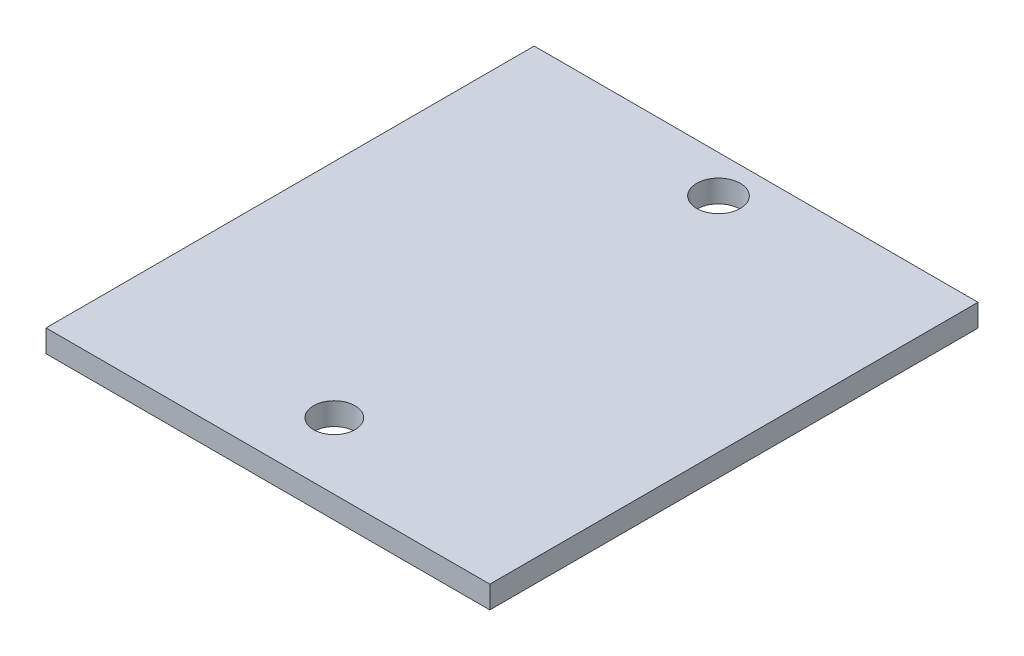
ISO-10303-21;
HEADER;
FILE_DESCRIPTION(('STEP AP214'),'2;1');
FILE_NAME('part.step','',(''),(''),'','','');
FILE_SCHEMA(('AUTOMOTIVE_DESIGN { 1 0 10303 214 1 1 1 1 }'));
ENDSEC;
DATA;
#1=APPLICATION_CONTEXT('core data for automotive mechanical design processes');
#2=APPLICATION_PROTOCOL_DEFINITION('international standard','automotive_design',2000,#1);
#3=PRODUCT_CONTEXT('',#1,'mechanical');
#4=PRODUCT('Part','Part','',(#3));
#5=PRODUCT_RELATED_PRODUCT_CATEGORY('part','',(#4));
#6=PRODUCT_DEFINITION_FORMATION('','',#4);
#7=PRODUCT_DEFINITION_CONTEXT('part definition',#1,'design');
#8=PRODUCT_DEFINITION('design','',#6,#7);
#9=PRODUCT_DEFINITION_SHAPE('','',#8);
#10=(LENGTH_UNIT() NAMED_UNIT(*) SI_UNIT(.MILLI.,.METRE.));
#11=(NAMED_UNIT(*) PLANE_ANGLE_UNIT() SI_UNIT($,.RADIAN.));
#12=(NAMED_UNIT(*) SI_UNIT($,.STERADIAN.) SOLID_ANGLE_UNIT());
#13=UNCERTAINTY_MEASURE_WITH_UNIT(LENGTH_MEASURE(1.E-05),#10,'distance_accuracy_value','');
#14=(GEOMETRIC_REPRESENTATION_CONTEXT(3) GLOBAL_UNCERTAINTY_ASSIGNED_CONTEXT((#13)) GLOBAL_UNIT_ASSIGNED_CONTEXT((#10,
#11,#12)) REPRESENTATION_CONTEXT('',''));
#15=CARTESIAN_POINT('',(0.,0.,0.));
#16=DIRECTION('',(0.,0.,1.));
#17=DIRECTION('',(1.,0.,0.));
#18=AXIS2_PLACEMENT_3D('',#15,#16,#17);
#19=CARTESIAN_POINT('',(0.,3.2004,0.));
#20=DIRECTION('',(0.,-1.,0.));
#21=DIRECTION('',(0.,0.,-1.));
#22=AXIS2_PLACEMENT_3D('',#19,#20,#21);
#23=PLANE('',#22);
#24=CARTESIAN_POINT('',(0.,3.2004,25.4274462531816));
#25=DIRECTION('',(0.,1.,0.));
#26=DIRECTION('',(0.,0.,1.));
#27=AXIS2_PLACEMENT_3D('',#24,#25,#26);
#28=CIRCLE('',#27,2.97338415169685);
#29=CARTESIAN_POINT('',(0.,3.2004,28.4008304048785));
#30=VERTEX_POINT('',#29);
#31=EDGE_CURVE('E99',#30,#30,#28,.T.);
#32=ORIENTED_EDGE('',*,*,#31,.F.);
#33=EDGE_LOOP('',(#32));
#34=FACE_BOUND('',#33,.T.);
#35=DIRECTION('',(0.,0.,-1.));
#36=VECTOR('',#35,1.);
#37=CARTESIAN_POINT('',(31.75,3.2004,34.925));
#38=LINE('',#37,#36);
#39=CARTESIAN_POINT('',(31.75,3.2004,34.925));
#40=VERTEX_POINT('',#39);
#41=CARTESIAN_POINT('',(31.75,3.2004,-34.925));
#42=VERTEX_POINT('',#41);
#43=EDGE_CURVE('E84',#40,#42,#38,.T.);
#44=ORIENTED_EDGE('',*,*,#43,.T.);
#45=DIRECTION('',(-1.,0.,0.));
#46=VECTOR('',#45,1.);
#47=CARTESIAN_POINT('',(-31.75,3.2004,-34.925));
#48=LINE('',#47,#46);
#49=CARTESIAN_POINT('',(-31.75,3.2004,-34.925));
#50=VERTEX_POINT('',#49);
#51=EDGE_CURVE('E79',#42,#50,#48,.T.);
#52=ORIENTED_EDGE('',*,*,#51,.T.);
#53=DIRECTION('',(0.,0.,1.));
#54=VECTOR('',#53,1.);
#55=CARTESIAN_POINT('',(-31.75,3.2004,34.925));
#56=LINE('',#55,#54);
#57=CARTESIAN_POINT('',(-31.75,3.2004,34.925));
#58=VERTEX_POINT('',#57);
#59=EDGE_CURVE('E82',#50,#58,#56,.T.);
#60=ORIENTED_EDGE('',*,*,#59,.T.);
#61=DIRECTION('',(1.,0.,0.));
#62=VECTOR('',#61,1.);
#63=CARTESIAN_POINT('',(-31.75,3.2004,34.925));
#64=LINE('',#63,#62);
#65=EDGE_CURVE('E49',#58,#40,#64,.T.);
#66=ORIENTED_EDGE('',*,*,#65,.T.);
#67=EDGE_LOOP('',(#44,#52,#60,#66));
#68=FACE_BOUND('',#67,.T.);
#69=CARTESIAN_POINT('',(0.,3.2004,-29.5453855353034));
#70=DIRECTION('',(0.,1.,0.));
#71=DIRECTION('',(0.,0.,1.));
#72=AXIS2_PLACEMENT_3D('',#69,#70,#71);
#73=CIRCLE('',#72,3.12025513203287);
#74=CARTESIAN_POINT('',(0.,3.2004,-26.4251304032705));
#75=VERTEX_POINT('',#74);
#76=EDGE_CURVE('E114',#75,#75,#73,.T.);
#77=ORIENTED_EDGE('',*,*,#76,.F.);
#78=EDGE_LOOP('',(#77));
#79=FACE_BOUND('',#78,.T.);
#80=ADVANCED_FACE('F32',(#34,#68,#79),#23,.F.);
#81=CARTESIAN_POINT('',(0.,0.,0.));
#82=DIRECTION('',(0.,-1.,0.));
#83=DIRECTION('',(0.,0.,-1.));
#84=AXIS2_PLACEMENT_3D('',#81,#82,#83);
#85=PLANE('',#84);
#86=CARTESIAN_POINT('',(0.,0.,25.4274462531816));
#87=DIRECTION('',(0.,1.,0.));
#88=DIRECTION('',(0.,0.,1.));
#89=AXIS2_PLACEMENT_3D('',#86,#87,#88);
#90=CIRCLE('',#89,2.97338415169685);
#91=CARTESIAN_POINT('',(0.,0.,28.4008304048785));
#92=VERTEX_POINT('',#91);
#93=EDGE_CURVE('E111',#92,#92,#90,.T.);
#94=ORIENTED_EDGE('',*,*,#93,.T.);
#95=EDGE_LOOP('',(#94));
#96=FACE_BOUND('',#95,.T.);
#97=DIRECTION('',(0.,0.,-1.));
#98=VECTOR('',#97,1.);
#99=CARTESIAN_POINT('',(31.75,0.,34.925));
#100=LINE('',#99,#98);
#101=CARTESIAN_POINT('',(31.75,0.,34.925));
#102=VERTEX_POINT('',#101);
#103=CARTESIAN_POINT('',(31.75,0.,-34.925));
#104=VERTEX_POINT('',#103);
#105=EDGE_CURVE('E96',#102,#104,#100,.T.);
#106=ORIENTED_EDGE('',*,*,#105,.F.);
#107=DIRECTION('',(1.,0.,0.));
#108=VECTOR('',#107,1.);
#109=CARTESIAN_POINT('',(-31.75,0.,34.925));
#110=LINE('',#109,#108);
#111=CARTESIAN_POINT('',(-31.75,0.,34.925));
#112=VERTEX_POINT('',#111);
#113=EDGE_CURVE('E72',#112,#102,#110,.T.);
#114=ORIENTED_EDGE('',*,*,#113,.F.);
#115=DIRECTION('',(0.,0.,1.));
#116=VECTOR('',#115,1.);
#117=CARTESIAN_POINT('',(-31.75,0.,34.925));
#118=LINE('',#117,#116);
#119=CARTESIAN_POINT('',(-31.75,0.,-34.925));
#120=VERTEX_POINT('',#119);
#121=EDGE_CURVE('E66',#120,#112,#118,.T.);
#122=ORIENTED_EDGE('',*,*,#121,.F.);
#123=DIRECTION('',(-1.,0.,0.));
#124=VECTOR('',#123,1.);
#125=CARTESIAN_POINT('',(-31.75,0.,-34.925));
#126=LINE('',#125,#124);
#127=EDGE_CURVE('E88',#104,#120,#126,.T.);
#128=ORIENTED_EDGE('',*,*,#127,.F.);
#129=EDGE_LOOP('',(#106,#114,#122,#128));
#130=FACE_BOUND('',#129,.T.);
#131=CARTESIAN_POINT('',(0.,0.,-29.5453855353034));
#132=DIRECTION('',(0.,1.,0.));
#133=DIRECTION('',(0.,0.,1.));
#134=AXIS2_PLACEMENT_3D('',#131,#132,#133);
#135=CIRCLE('',#134,3.12025513203287);
#136=CARTESIAN_POINT('',(0.,0.,-26.4251304032705));
#137=VERTEX_POINT('',#136);
#138=EDGE_CURVE('E117',#137,#137,#135,.T.);
#139=ORIENTED_EDGE('',*,*,#138,.T.);
#140=EDGE_LOOP('',(#139));
#141=FACE_BOUND('',#140,.T.);
#142=ADVANCED_FACE('F107',(#96,#130,#141),#85,.T.);
#143=CARTESIAN_POINT('',(31.75,3.2004,34.925));
#144=DIRECTION('',(-1.,0.,0.));
#145=DIRECTION('',(0.,0.,1.));
#146=AXIS2_PLACEMENT_3D('',#143,#144,#145);
#147=PLANE('',#146);
#148=ORIENTED_EDGE('',*,*,#105,.T.);
#149=DIRECTION('',(0.,-1.,0.));
#150=VECTOR('',#149,1.);
#151=CARTESIAN_POINT('',(31.75,3.2004,-34.925));
#152=LINE('',#151,#150);
#153=EDGE_CURVE('E11',#42,#104,#152,.T.);
#154=ORIENTED_EDGE('',*,*,#153,.F.);
#155=ORIENTED_EDGE('',*,*,#43,.F.);
#156=DIRECTION('',(0.,-1.,0.));
#157=VECTOR('',#156,1.);
#158=CARTESIAN_POINT('',(31.75,3.2004,34.925));
#159=LINE('',#158,#157);
#160=EDGE_CURVE('E92',#40,#102,#159,.T.);
#161=ORIENTED_EDGE('',*,*,#160,.T.);
#162=EDGE_LOOP('',(#148,#154,#155,#161));
#163=FACE_BOUND('',#162,.T.);
#164=ADVANCED_FACE('F34',(#163),#147,.F.);
#165=CARTESIAN_POINT('',(-31.75,3.2004,-34.925));
#166=DIRECTION('',(0.,0.,1.));
#167=DIRECTION('',(1.,0.,0.));
#168=AXIS2_PLACEMENT_3D('',#165,#166,#167);
#169=PLANE('',#168);
#170=ORIENTED_EDGE('',*,*,#127,.T.);
#171=DIRECTION('',(0.,-1.,0.));
#172=VECTOR('',#171,1.);
#173=CARTESIAN_POINT('',(-31.75,3.2004,-34.925));
#174=LINE('',#173,#172);
#175=EDGE_CURVE('E41',#50,#120,#174,.T.);
#176=ORIENTED_EDGE('',*,*,#175,.F.);
#177=ORIENTED_EDGE('',*,*,#51,.F.);
#178=ORIENTED_EDGE('',*,*,#153,.T.);
#179=EDGE_LOOP('',(#170,#176,#177,#178));
#180=FACE_BOUND('',#179,.T.);
#181=ADVANCED_FACE('F87',(#180),#169,.F.);
#182=CARTESIAN_POINT('',(-31.75,3.2004,34.925));
#183=DIRECTION('',(1.,0.,0.));
#184=DIRECTION('',(0.,0.,-1.));
#185=AXIS2_PLACEMENT_3D('',#182,#183,#184);
#186=PLANE('',#185);
#187=ORIENTED_EDGE('',*,*,#121,.T.);
#188=DIRECTION('',(0.,-1.,0.));
#189=VECTOR('',#188,1.);
#190=CARTESIAN_POINT('',(-31.75,3.2004,34.925));
#191=LINE('',#190,#189);
#192=EDGE_CURVE('E89',#58,#112,#191,.T.);
#193=ORIENTED_EDGE('',*,*,#192,.F.);
#194=ORIENTED_EDGE('',*,*,#59,.F.);
#195=ORIENTED_EDGE('',*,*,#175,.T.);
#196=EDGE_LOOP('',(#187,#193,#194,#195));
#197=FACE_BOUND('',#196,.T.);
#198=ADVANCED_FACE('F90',(#197),#186,.F.);
#199=CARTESIAN_POINT('',(-31.75,3.2004,34.925));
#200=DIRECTION('',(0.,0.,-1.));
#201=DIRECTION('',(-1.,0.,0.));
#202=AXIS2_PLACEMENT_3D('',#199,#200,#201);
#203=PLANE('',#202);
#204=ORIENTED_EDGE('',*,*,#113,.T.);
#205=ORIENTED_EDGE('',*,*,#160,.F.);
#206=ORIENTED_EDGE('',*,*,#65,.F.);
#207=ORIENTED_EDGE('',*,*,#192,.T.);
#208=EDGE_LOOP('',(#204,#205,#206,#207));
#209=FACE_BOUND('',#208,.T.);
#210=ADVANCED_FACE('F104',(#209),#203,.F.);
#211=CARTESIAN_POINT('',(0.,3.2004,25.4274462531816));
#212=DIRECTION('',(0.,-1.,0.));
#213=DIRECTION('',(0.,0.,-1.));
#214=AXIS2_PLACEMENT_3D('',#211,#212,#213);
#215=CYLINDRICAL_SURFACE('',#214,2.97338415169685);
#216=ORIENTED_EDGE('',*,*,#31,.T.);
#217=EDGE_LOOP('',(#216));
#218=FACE_BOUND('',#217,.T.);
#219=ORIENTED_EDGE('',*,*,#93,.F.);
#220=EDGE_LOOP('',(#219));
#221=FACE_BOUND('',#220,.T.);
#222=ADVANCED_FACE('F135',(#218,#221),#215,.F.);
#223=CARTESIAN_POINT('',(0.,3.2004,-29.5453855353034));
#224=DIRECTION('',(0.,-1.,0.));
#225=DIRECTION('',(0.,0.,-1.));
#226=AXIS2_PLACEMENT_3D('',#223,#224,#225);
#227=CYLINDRICAL_SURFACE('',#226,3.12025513203287);
#228=ORIENTED_EDGE('',*,*,#76,.T.);
#229=EDGE_LOOP('',(#228));
#230=FACE_BOUND('',#229,.T.);
#231=ORIENTED_EDGE('',*,*,#138,.F.);
#232=EDGE_LOOP('',(#231));
#233=FACE_BOUND('',#232,.T.);
#234=ADVANCED_FACE('F123',(#230,#233),#227,.F.);
#235=CLOSED_SHELL('',(#80,#142,#164,#181,#198,#210,#222,#234));
#236=MANIFOLD_SOLID_BREP('B2',#235);
#237=ADVANCED_BREP_SHAPE_REPRESENTATION('',(#18,#236),#14);
#238=SHAPE_DEFINITION_REPRESENTATION(#9,#237);
ENDSEC;
END-ISO-10303-21;
